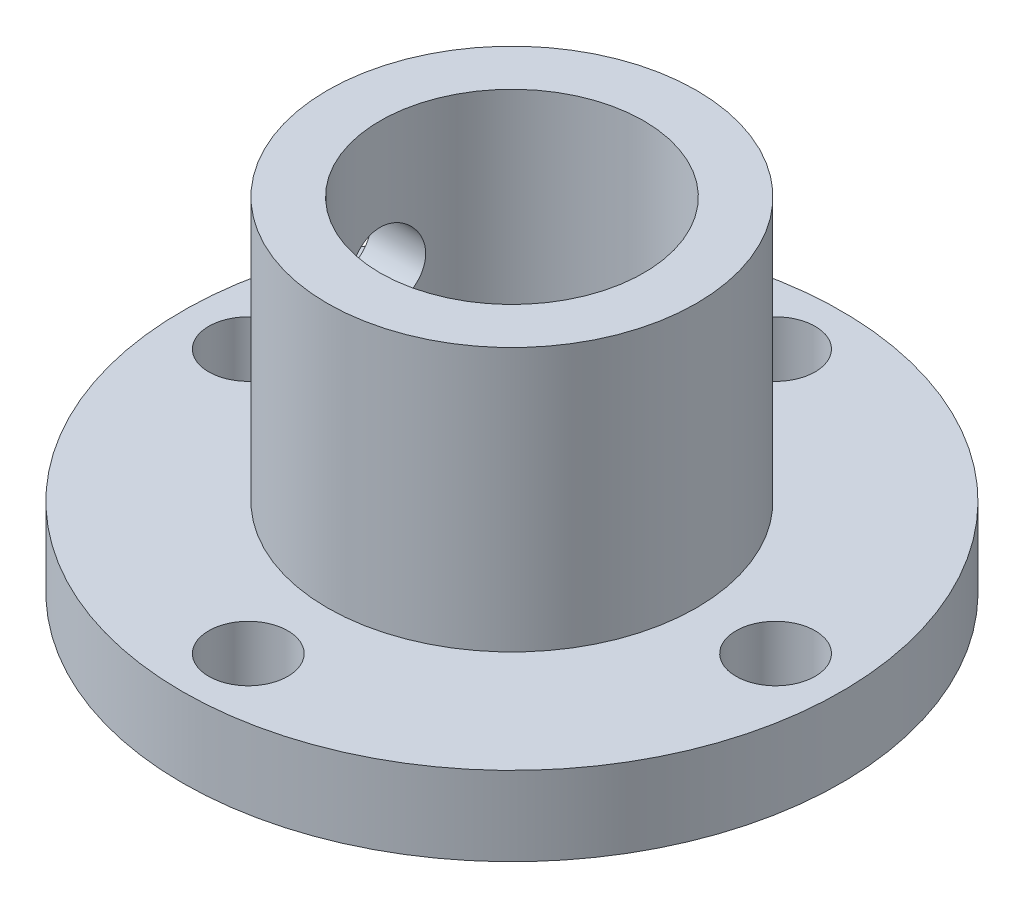
ISO-10303-21;
HEADER;
FILE_DESCRIPTION(('STEP AP214'),'2;1');
FILE_NAME('part.step','',(''),(''),'','','');
FILE_SCHEMA(('AUTOMOTIVE_DESIGN { 1 0 10303 214 1 1 1 1 }'));
ENDSEC;
DATA;
#1=APPLICATION_CONTEXT('core data for automotive mechanical design processes');
#2=APPLICATION_PROTOCOL_DEFINITION('international standard','automotive_design',2000,#1);
#3=PRODUCT_CONTEXT('',#1,'mechanical');
#4=PRODUCT('Part','Part','',(#3));
#5=PRODUCT_RELATED_PRODUCT_CATEGORY('part','',(#4));
#6=PRODUCT_DEFINITION_FORMATION('','',#4);
#7=PRODUCT_DEFINITION_CONTEXT('part definition',#1,'design');
#8=PRODUCT_DEFINITION('design','',#6,#7);
#9=PRODUCT_DEFINITION_SHAPE('','',#8);
#10=(LENGTH_UNIT() NAMED_UNIT(*) SI_UNIT(.MILLI.,.METRE.));
#11=(NAMED_UNIT(*) PLANE_ANGLE_UNIT() SI_UNIT($,.RADIAN.));
#12=(NAMED_UNIT(*) SI_UNIT($,.STERADIAN.) SOLID_ANGLE_UNIT());
#13=UNCERTAINTY_MEASURE_WITH_UNIT(LENGTH_MEASURE(1.E-05),#10,'distance_accuracy_value','');
#14=(GEOMETRIC_REPRESENTATION_CONTEXT(3) GLOBAL_UNCERTAINTY_ASSIGNED_CONTEXT((#13)) GLOBAL_UNIT_ASSIGNED_CONTEXT((#10,
#11,#12)) REPRESENTATION_CONTEXT('',''));
#15=CARTESIAN_POINT('',(0.,0.,0.));
#16=DIRECTION('',(0.,0.,1.));
#17=DIRECTION('',(1.,0.,0.));
#18=AXIS2_PLACEMENT_3D('',#15,#16,#17);
#19=CARTESIAN_POINT('',(0.,3.,0.));
#20=DIRECTION('',(0.,1.,0.));
#21=DIRECTION('',(0.,0.,1.));
#22=AXIS2_PLACEMENT_3D('',#19,#20,#21);
#23=PLANE('',#22);
#24=CARTESIAN_POINT('',(0.,3.,0.));
#25=DIRECTION('',(0.,1.,0.));
#26=DIRECTION('',(1.,0.,0.));
#27=AXIS2_PLACEMENT_3D('',#24,#25,#26);
#28=CIRCLE('',#27,7.);
#29=CARTESIAN_POINT('',(7.,3.,0.));
#30=VERTEX_POINT('',#29);
#31=EDGE_CURVE('E87',#30,#30,#28,.T.);
#32=ORIENTED_EDGE('',*,*,#31,.F.);
#33=EDGE_LOOP('',(#32));
#34=FACE_BOUND('',#33,.T.);
#35=CARTESIAN_POINT('',(-10.,3.,0.));
#36=DIRECTION('',(0.,1.,0.));
#37=DIRECTION('',(0.,0.,1.));
#38=AXIS2_PLACEMENT_3D('',#35,#36,#37);
#39=CIRCLE('',#38,1.5);
#40=CARTESIAN_POINT('',(-10.,3.,1.5));
#41=VERTEX_POINT('',#40);
#42=EDGE_CURVE('E72',#41,#41,#39,.T.);
#43=ORIENTED_EDGE('',*,*,#42,.F.);
#44=EDGE_LOOP('',(#43));
#45=FACE_BOUND('',#44,.T.);
#46=CARTESIAN_POINT('',(10.,3.,0.));
#47=DIRECTION('',(0.,1.,0.));
#48=DIRECTION('',(0.,0.,1.));
#49=AXIS2_PLACEMENT_3D('',#46,#47,#48);
#50=CIRCLE('',#49,1.5);
#51=CARTESIAN_POINT('',(10.,3.,1.5));
#52=VERTEX_POINT('',#51);
#53=EDGE_CURVE('E61',#52,#52,#50,.T.);
#54=ORIENTED_EDGE('',*,*,#53,.F.);
#55=EDGE_LOOP('',(#54));
#56=FACE_BOUND('',#55,.T.);
#57=CARTESIAN_POINT('',(0.,3.,0.));
#58=DIRECTION('',(0.,1.,0.));
#59=DIRECTION('',(0.,0.,1.));
#60=AXIS2_PLACEMENT_3D('',#57,#58,#59);
#61=CIRCLE('',#60,12.5);
#62=CARTESIAN_POINT('',(0.,3.,12.5));
#63=VERTEX_POINT('',#62);
#64=EDGE_CURVE('E11',#63,#63,#61,.T.);
#65=ORIENTED_EDGE('',*,*,#64,.T.);
#66=EDGE_LOOP('',(#65));
#67=FACE_BOUND('',#66,.T.);
#68=CARTESIAN_POINT('',(0.,3.,10.));
#69=DIRECTION('',(0.,1.,0.));
#70=DIRECTION('',(0.,0.,1.));
#71=AXIS2_PLACEMENT_3D('',#68,#69,#70);
#72=CIRCLE('',#71,1.5);
#73=CARTESIAN_POINT('',(0.,3.,11.5));
#74=VERTEX_POINT('',#73);
#75=EDGE_CURVE('E66',#74,#74,#72,.T.);
#76=ORIENTED_EDGE('',*,*,#75,.F.);
#77=EDGE_LOOP('',(#76));
#78=FACE_BOUND('',#77,.T.);
#79=CARTESIAN_POINT('',(0.,3.,-10.));
#80=DIRECTION('',(0.,1.,0.));
#81=DIRECTION('',(0.,0.,1.));
#82=AXIS2_PLACEMENT_3D('',#79,#80,#81);
#83=CIRCLE('',#82,1.5);
#84=CARTESIAN_POINT('',(0.,3.,-8.5));
#85=VERTEX_POINT('',#84);
#86=EDGE_CURVE('E78',#85,#85,#83,.T.);
#87=ORIENTED_EDGE('',*,*,#86,.F.);
#88=EDGE_LOOP('',(#87));
#89=FACE_BOUND('',#88,.T.);
#90=ADVANCED_FACE('F43',(#34,#45,#56,#67,#78,#89),#23,.T.);
#91=CARTESIAN_POINT('',(0.,0.,0.));
#92=DIRECTION('',(0.,1.,0.));
#93=DIRECTION('',(0.,0.,1.));
#94=AXIS2_PLACEMENT_3D('',#91,#92,#93);
#95=PLANE('',#94);
#96=CARTESIAN_POINT('',(0.,0.,0.));
#97=DIRECTION('',(0.,1.,0.));
#98=DIRECTION('',(0.,0.,1.));
#99=AXIS2_PLACEMENT_3D('',#96,#97,#98);
#100=CIRCLE('',#99,5.);
#101=CARTESIAN_POINT('',(0.,0.,5.));
#102=VERTEX_POINT('',#101);
#103=EDGE_CURVE('E102',#102,#102,#100,.T.);
#104=ORIENTED_EDGE('',*,*,#103,.T.);
#105=EDGE_LOOP('',(#104));
#106=FACE_BOUND('',#105,.T.);
#107=CARTESIAN_POINT('',(0.,0.,0.));
#108=DIRECTION('',(0.,1.,0.));
#109=DIRECTION('',(0.,0.,1.));
#110=AXIS2_PLACEMENT_3D('',#107,#108,#109);
#111=CIRCLE('',#110,12.5);
#112=CARTESIAN_POINT('',(0.,0.,12.5));
#113=VERTEX_POINT('',#112);
#114=EDGE_CURVE('E56',#113,#113,#111,.T.);
#115=ORIENTED_EDGE('',*,*,#114,.F.);
#116=EDGE_LOOP('',(#115));
#117=FACE_BOUND('',#116,.T.);
#118=CARTESIAN_POINT('',(10.,0.,0.));
#119=DIRECTION('',(0.,1.,0.));
#120=DIRECTION('',(0.,0.,1.));
#121=AXIS2_PLACEMENT_3D('',#118,#119,#120);
#122=CIRCLE('',#121,1.5);
#123=CARTESIAN_POINT('',(10.,0.,1.5));
#124=VERTEX_POINT('',#123);
#125=EDGE_CURVE('E63',#124,#124,#122,.T.);
#126=ORIENTED_EDGE('',*,*,#125,.T.);
#127=EDGE_LOOP('',(#126));
#128=FACE_BOUND('',#127,.T.);
#129=CARTESIAN_POINT('',(0.,0.,10.));
#130=DIRECTION('',(0.,1.,0.));
#131=DIRECTION('',(0.,0.,1.));
#132=AXIS2_PLACEMENT_3D('',#129,#130,#131);
#133=CIRCLE('',#132,1.5);
#134=CARTESIAN_POINT('',(0.,0.,11.5));
#135=VERTEX_POINT('',#134);
#136=EDGE_CURVE('E69',#135,#135,#133,.T.);
#137=ORIENTED_EDGE('',*,*,#136,.T.);
#138=EDGE_LOOP('',(#137));
#139=FACE_BOUND('',#138,.T.);
#140=CARTESIAN_POINT('',(-10.,0.,0.));
#141=DIRECTION('',(0.,1.,0.));
#142=DIRECTION('',(0.,0.,1.));
#143=AXIS2_PLACEMENT_3D('',#140,#141,#142);
#144=CIRCLE('',#143,1.5);
#145=CARTESIAN_POINT('',(-10.,0.,1.5));
#146=VERTEX_POINT('',#145);
#147=EDGE_CURVE('E75',#146,#146,#144,.T.);
#148=ORIENTED_EDGE('',*,*,#147,.T.);
#149=EDGE_LOOP('',(#148));
#150=FACE_BOUND('',#149,.T.);
#151=CARTESIAN_POINT('',(0.,0.,-10.));
#152=DIRECTION('',(0.,1.,0.));
#153=DIRECTION('',(0.,0.,1.));
#154=AXIS2_PLACEMENT_3D('',#151,#152,#153);
#155=CIRCLE('',#154,1.5);
#156=CARTESIAN_POINT('',(0.,0.,-8.5));
#157=VERTEX_POINT('',#156);
#158=EDGE_CURVE('E81',#157,#157,#155,.T.);
#159=ORIENTED_EDGE('',*,*,#158,.T.);
#160=EDGE_LOOP('',(#159));
#161=FACE_BOUND('',#160,.T.);
#162=ADVANCED_FACE('F129',(#106,#117,#128,#139,#150,#161),#95,.F.);
#163=CARTESIAN_POINT('',(0.,3.,0.));
#164=DIRECTION('',(0.,-1.,0.));
#165=DIRECTION('',(0.,0.,-1.));
#166=AXIS2_PLACEMENT_3D('',#163,#164,#165);
#167=CYLINDRICAL_SURFACE('',#166,12.5);
#168=ORIENTED_EDGE('',*,*,#64,.F.);
#169=EDGE_LOOP('',(#168));
#170=FACE_BOUND('',#169,.T.);
#171=ORIENTED_EDGE('',*,*,#114,.T.);
#172=EDGE_LOOP('',(#171));
#173=FACE_BOUND('',#172,.T.);
#174=ADVANCED_FACE('F45',(#170,#173),#167,.T.);
#175=CARTESIAN_POINT('',(10.,3.,0.));
#176=DIRECTION('',(0.,-1.,0.));
#177=DIRECTION('',(0.,0.,-1.));
#178=AXIS2_PLACEMENT_3D('',#175,#176,#177);
#179=CYLINDRICAL_SURFACE('',#178,1.5);
#180=ORIENTED_EDGE('',*,*,#53,.T.);
#181=EDGE_LOOP('',(#180));
#182=FACE_BOUND('',#181,.T.);
#183=ORIENTED_EDGE('',*,*,#125,.F.);
#184=EDGE_LOOP('',(#183));
#185=FACE_BOUND('',#184,.T.);
#186=ADVANCED_FACE('F140',(#182,#185),#179,.F.);
#187=CARTESIAN_POINT('',(0.,3.,10.));
#188=DIRECTION('',(0.,-1.,0.));
#189=DIRECTION('',(0.,0.,-1.));
#190=AXIS2_PLACEMENT_3D('',#187,#188,#189);
#191=CYLINDRICAL_SURFACE('',#190,1.5);
#192=ORIENTED_EDGE('',*,*,#75,.T.);
#193=EDGE_LOOP('',(#192));
#194=FACE_BOUND('',#193,.T.);
#195=ORIENTED_EDGE('',*,*,#136,.F.);
#196=EDGE_LOOP('',(#195));
#197=FACE_BOUND('',#196,.T.);
#198=ADVANCED_FACE('F143',(#194,#197),#191,.F.);
#199=CARTESIAN_POINT('',(-10.,3.,0.));
#200=DIRECTION('',(0.,-1.,0.));
#201=DIRECTION('',(0.,0.,-1.));
#202=AXIS2_PLACEMENT_3D('',#199,#200,#201);
#203=CYLINDRICAL_SURFACE('',#202,1.5);
#204=ORIENTED_EDGE('',*,*,#42,.T.);
#205=EDGE_LOOP('',(#204));
#206=FACE_BOUND('',#205,.T.);
#207=ORIENTED_EDGE('',*,*,#147,.F.);
#208=EDGE_LOOP('',(#207));
#209=FACE_BOUND('',#208,.T.);
#210=ADVANCED_FACE('F125',(#206,#209),#203,.F.);
#211=CARTESIAN_POINT('',(0.,3.,-10.));
#212=DIRECTION('',(0.,-1.,0.));
#213=DIRECTION('',(0.,0.,-1.));
#214=AXIS2_PLACEMENT_3D('',#211,#212,#213);
#215=CYLINDRICAL_SURFACE('',#214,1.5);
#216=ORIENTED_EDGE('',*,*,#86,.T.);
#217=EDGE_LOOP('',(#216));
#218=FACE_BOUND('',#217,.T.);
#219=ORIENTED_EDGE('',*,*,#158,.F.);
#220=EDGE_LOOP('',(#219));
#221=FACE_BOUND('',#220,.T.);
#222=ADVANCED_FACE('F118',(#218,#221),#215,.F.);
#223=CARTESIAN_POINT('',(0.,13.,0.));
#224=DIRECTION('',(0.,1.,0.));
#225=DIRECTION('',(0.,0.,1.));
#226=AXIS2_PLACEMENT_3D('',#223,#224,#225);
#227=PLANE('',#226);
#228=CARTESIAN_POINT('',(0.,13.,0.));
#229=DIRECTION('',(0.,1.,0.));
#230=DIRECTION('',(1.,0.,0.));
#231=AXIS2_PLACEMENT_3D('',#228,#229,#230);
#232=CIRCLE('',#231,7.);
#233=CARTESIAN_POINT('',(7.,13.,0.));
#234=VERTEX_POINT('',#233);
#235=EDGE_CURVE('E84',#234,#234,#232,.T.);
#236=ORIENTED_EDGE('',*,*,#235,.T.);
#237=EDGE_LOOP('',(#236));
#238=FACE_BOUND('',#237,.T.);
#239=CARTESIAN_POINT('',(0.,13.,0.));
#240=DIRECTION('',(0.,1.,0.));
#241=DIRECTION('',(0.,0.,1.));
#242=AXIS2_PLACEMENT_3D('',#239,#240,#241);
#243=CIRCLE('',#242,5.);
#244=CARTESIAN_POINT('',(0.,13.,5.));
#245=VERTEX_POINT('',#244);
#246=EDGE_CURVE('E90',#245,#245,#243,.T.);
#247=ORIENTED_EDGE('',*,*,#246,.F.);
#248=EDGE_LOOP('',(#247));
#249=FACE_BOUND('',#248,.T.);
#250=ADVANCED_FACE('F116',(#238,#249),#227,.T.);
#251=CARTESIAN_POINT('',(0.,13.,0.));
#252=DIRECTION('',(0.,-1.,0.));
#253=DIRECTION('',(0.,0.,-1.));
#254=AXIS2_PLACEMENT_3D('',#251,#252,#253);
#255=CYLINDRICAL_SURFACE('',#254,7.);
#256=CARTESIAN_POINT('',(-6.83739716558867,8.,-1.5));
#257=CARTESIAN_POINT('',(-6.83739884558951,8.08321115248195,-1.49999708238613));
#258=CARTESIAN_POINT('',(-6.83893272341929,8.16645777394212,-1.49305236244768));
#259=CARTESIAN_POINT('',(-6.84489178429867,8.33058667224201,-1.46548559252999));
#260=CARTESIAN_POINT('',(-6.84931911211841,8.41146714867621,-1.44485339653622));
#261=CARTESIAN_POINT('',(-6.86054115293409,8.5684657495742,-1.39058863684599));
#262=CARTESIAN_POINT('',(-6.86733332725825,8.64458887812147,-1.35697000991314));
#263=CARTESIAN_POINT('',(-6.88251670848644,8.79011527394461,-1.27772617673341));
#264=CARTESIAN_POINT('',(-6.89090786877545,8.85951873702908,-1.23210132048776));
#265=CARTESIAN_POINT('',(-6.90849578796654,8.99076296148212,-1.12935142570221));
#266=CARTESIAN_POINT('',(-6.91770249871754,9.05247887623996,-1.07206859483983));
#267=CARTESIAN_POINT('',(-6.93579691710397,9.16550355440578,-0.947969508129577));
#268=CARTESIAN_POINT('',(-6.94468460051417,9.21681152886007,-0.881152530217676));
#269=CARTESIAN_POINT('',(-6.96124769109432,9.30805544449143,-0.739047288464582));
#270=CARTESIAN_POINT('',(-6.96890998819429,9.34787165577062,-0.663680488229954));
#271=CARTESIAN_POINT('',(-6.98204671042934,9.41422769144629,-0.507134269342596));
#272=CARTESIAN_POINT('',(-6.98752137103329,9.44076894478628,-0.425955477380312));
#273=CARTESIAN_POINT('',(-6.9955956528118,9.47942997093134,-0.261387187671512));
#274=CARTESIAN_POINT('',(-6.99823733378385,9.49176092855243,-0.178049400596923));
#275=CARTESIAN_POINT('',(-7.00049362207002,9.50231127731326,-0.0104489453066449));
#276=CARTESIAN_POINT('',(-7.00010856232698,9.50053222056076,0.0738136201647589));
#277=CARTESIAN_POINT('',(-6.99638700862558,9.48307103533642,0.239417029250511));
#278=CARTESIAN_POINT('',(-6.99309883152432,9.46761649971008,0.320783115362112));
#279=CARTESIAN_POINT('',(-6.98399541589104,9.42360531814814,0.479739463978388));
#280=CARTESIAN_POINT('',(-6.97818006616518,9.39504809570026,0.557329560175054));
#281=CARTESIAN_POINT('',(-6.96459754646858,9.32543854111148,0.707167497556552));
#282=CARTESIAN_POINT('',(-6.95681685803946,9.28429923279565,0.779373657015788));
#283=CARTESIAN_POINT('',(-6.94015793743865,9.1907580318364,0.915940926562845));
#284=CARTESIAN_POINT('',(-6.93127956144693,9.1383546626997,0.980301006451528));
#285=CARTESIAN_POINT('',(-6.91319326460925,9.02253145547214,1.10070208800198));
#286=CARTESIAN_POINT('',(-6.90398230372853,8.95891242064296,1.1565511732025));
#287=CARTESIAN_POINT('',(-6.88643566831974,8.82311671493149,1.25682243234728));
#288=CARTESIAN_POINT('',(-6.87810001563386,8.75093983059475,1.30124432118068));
#289=CARTESIAN_POINT('',(-6.86324023586723,8.59977549893624,1.37748077573296));
#290=CARTESIAN_POINT('',(-6.85672115127775,8.52076987614756,1.40926035088923));
#291=CARTESIAN_POINT('',(-6.84630340806617,8.35836723405356,1.45903495159115));
#292=CARTESIAN_POINT('',(-6.84240435218483,8.27497088255681,1.47703206694628));
#293=CARTESIAN_POINT('',(-6.83774881255446,8.10790424735029,1.49843586024652));
#294=CARTESIAN_POINT('',(-6.83693227051701,8.0242713249227,1.5021214192864));
#295=CARTESIAN_POINT('',(-6.83837239573993,7.85758600681831,1.49555139642373));
#296=CARTESIAN_POINT('',(-6.84062886101063,7.77453357334645,1.48529673081635));
#297=CARTESIAN_POINT('',(-6.84790415484206,7.61232956501924,1.45137894635584));
#298=CARTESIAN_POINT('',(-6.85289155274364,7.53314456740304,1.42786830251553));
#299=CARTESIAN_POINT('',(-6.86503859869777,7.37983766246708,1.36827052946749));
#300=CARTESIAN_POINT('',(-6.87219844772849,7.30571622436581,1.33218223662818));
#301=CARTESIAN_POINT('',(-6.88801634080345,7.16343031524108,1.24783504416705));
#302=CARTESIAN_POINT('',(-6.89669501746317,7.09537041798782,1.19940368590792));
#303=CARTESIAN_POINT('',(-6.91451775360139,6.96824165412621,1.09197183833601));
#304=CARTESIAN_POINT('',(-6.92366186834461,6.90917385855153,1.03297009182161));
#305=CARTESIAN_POINT('',(-6.94158239990173,6.80062969705524,0.904812764420814));
#306=CARTESIAN_POINT('',(-6.95034935607746,6.75134308384299,0.835494925828771));
#307=CARTESIAN_POINT('',(-6.96635610714901,6.66511459064895,0.689401481282277));
#308=CARTESIAN_POINT('',(-6.97359597176692,6.62817214702717,0.61262621604374));
#309=CARTESIAN_POINT('',(-6.98569278381574,6.56794794536152,0.454265418982041));
#310=CARTESIAN_POINT('',(-6.99056443803698,6.54458169625372,0.372713193075173));
#311=CARTESIAN_POINT('',(-6.9974393930198,6.51190829426768,0.20672517700329));
#312=CARTESIAN_POINT('',(-6.99944309312296,6.50259918402609,0.122289789973994));
#313=CARTESIAN_POINT('',(-7.00034511009057,6.49838934758814,-0.0452637170528279));
#314=CARTESIAN_POINT('',(-6.99930459001667,6.50320484139538,-0.128374505509228));
#315=CARTESIAN_POINT('',(-6.99436552363383,6.52647476351903,-0.292572938415959));
#316=CARTESIAN_POINT('',(-6.99046702473686,6.54492896557832,-0.373660616405284));
#317=CARTESIAN_POINT('',(-6.98025388638537,6.59481880624949,-0.531301948487269));
#318=CARTESIAN_POINT('',(-6.97394646430492,6.62621568938556,-0.607868365073176));
#319=CARTESIAN_POINT('',(-6.95959036050661,6.70106127116912,-0.754684956723219));
#320=CARTESIAN_POINT('',(-6.9515415172034,6.74451108830603,-0.82493454479614));
#321=CARTESIAN_POINT('',(-6.93439809934494,6.84316231874267,-0.958512306895243));
#322=CARTESIAN_POINT('',(-6.92528708907874,6.89856415832131,-1.02169036510577));
#323=CARTESIAN_POINT('',(-6.90713690075836,7.01914061025035,-1.13795001457643));
#324=CARTESIAN_POINT('',(-6.89809774045682,7.08431756335561,-1.19102918062422));
#325=CARTESIAN_POINT('',(-6.88098693651916,7.22359049318568,-1.28623261596675));
#326=CARTESIAN_POINT('',(-6.87292905956533,7.29778935828702,-1.32820897809616));
#327=CARTESIAN_POINT('',(-6.85886497228049,7.45234372092325,-1.39903004659825));
#328=CARTESIAN_POINT('',(-6.85285699581573,7.53269384525307,-1.42788606423931));
#329=CARTESIAN_POINT('',(-6.84470560641996,7.67762613118586,-1.46638607121557));
#330=CARTESIAN_POINT('',(-6.84198283087953,7.74141167570783,-1.47896752507743));
#331=CARTESIAN_POINT('',(-6.83832799504406,7.87012431157732,-1.49577544043437));
#332=CARTESIAN_POINT('',(-6.83739585430069,7.93505135150832,-1.50000227727981));
#333=CARTESIAN_POINT('',(-6.83739716558867,8.,-1.5));
#334=B_SPLINE_CURVE_WITH_KNOTS('',3,(#256,#257,#258,#259,#260,#261,#262,#263,#264,#265,#266,
#267,#268,#269,#270,#271,#272,#273,#274,#275,#276,#277,#278,#279,#280,#281,#282,#283,#284,#285,
#286,#287,#288,#289,#290,#291,#292,#293,#294,#295,#296,#297,#298,#299,#300,#301,#302,#303,#304,
#305,#306,#307,#308,#309,#310,#311,#312,#313,#314,#315,#316,#317,#318,#319,#320,#321,#322,#323,
#324,#325,#326,#327,#328,#329,#330,#331,#332,#333),.UNSPECIFIED.,.T.,.F.,(4,2,2,2,2,2,2,2,2,2,2,
2,2,2,2,2,2,2,2,2,2,2,2,2,2,2,2,2,2,2,2,2,2,2,2,2,2,2,4),(0.,0.249395482027529,
0.498976038479964,0.748289491152758,0.997595676735284,1.25053229582692,1.50348808112879,
1.75899134820278,2.01446710646268,2.26609508151929,2.51769537777241,2.76518557667371,
3.01268666607584,3.26193888143437,3.51122378872315,3.76548960779295,4.01976177023092,
4.27473287411781,4.52966530953839,4.77960433192523,5.02952692653916,5.27663180749375,
5.5237595556315,5.77455010216318,6.02537049659078,6.2806621468321,6.53594213875541,
6.78961589824375,7.04325433208539,7.29183199644126,7.54040553715099,7.78824009619483,
8.03609766151365,8.28848914160965,8.54094115631232,8.79660380167248,9.05204561611687,
9.24671456122271,9.44137476018022),.UNSPECIFIED.);
#335=CARTESIAN_POINT('',(-6.83739716558867,8.,-1.5));
#336=VERTEX_POINT('',#335);
#337=EDGE_CURVE('E95',#336,#336,#334,.T.);
#338=ORIENTED_EDGE('',*,*,#337,.T.);
#339=EDGE_LOOP('',(#338));
#340=FACE_BOUND('',#339,.T.);
#341=ORIENTED_EDGE('',*,*,#235,.F.);
#342=EDGE_LOOP('',(#341));
#343=FACE_BOUND('',#342,.T.);
#344=ORIENTED_EDGE('',*,*,#31,.T.);
#345=EDGE_LOOP('',(#344));
#346=FACE_BOUND('',#345,.T.);
#347=ADVANCED_FACE('F103',(#340,#343,#346),#255,.T.);
#348=CARTESIAN_POINT('',(0.,13.,0.));
#349=DIRECTION('',(0.,-1.,0.));
#350=DIRECTION('',(0.,0.,-1.));
#351=AXIS2_PLACEMENT_3D('',#348,#349,#350);
#352=CYLINDRICAL_SURFACE('',#351,5.);
#353=CARTESIAN_POINT('',(-4.76969600708473,8.,-1.5));
#354=CARTESIAN_POINT('',(-4.7696968572698,8.0821945479424,-1.49999897633764));
#355=CARTESIAN_POINT('',(-4.77184390209069,8.16439922414402,-1.49322108167142));
#356=CARTESIAN_POINT('',(-4.780165783029,8.32640524959194,-1.46635844446749));
#357=CARTESIAN_POINT('',(-4.78634196493468,8.40620578650146,-1.44626925573578));
#358=CARTESIAN_POINT('',(-4.80196102485632,8.56103472827173,-1.39352753269955));
#359=CARTESIAN_POINT('',(-4.81139846703232,8.63607082963309,-1.36089589394243));
#360=CARTESIAN_POINT('',(-4.83246932547567,8.7796219339953,-1.28406421917929));
#361=CARTESIAN_POINT('',(-4.84410307041019,8.84813595868444,-1.23986245137053));
#362=CARTESIAN_POINT('',(-4.86866862185765,8.97886639057737,-1.13964754141627));
#363=CARTESIAN_POINT('',(-4.88162808311636,9.04084589794629,-1.08333207175807));
#364=CARTESIAN_POINT('',(-4.90714861936757,9.15463795132251,-0.9611362375796));
#365=CARTESIAN_POINT('',(-4.91970964297705,9.20644919044988,-0.895254645461112));
#366=CARTESIAN_POINT('',(-4.94333214579389,9.29946269983331,-0.754111437793691));
#367=CARTESIAN_POINT('',(-4.95435724342404,9.34042342444281,-0.678684021335816));
#368=CARTESIAN_POINT('',(-4.97334435920684,9.40898725904276,-0.521624645369355));
#369=CARTESIAN_POINT('',(-4.98130703789495,9.43659324985745,-0.439994028387913));
#370=CARTESIAN_POINT('',(-4.99307646003589,9.47688000109051,-0.27532385263083));
#371=CARTESIAN_POINT('',(-4.99699557369338,9.4899651276527,-0.192391398953802));
#372=CARTESIAN_POINT('',(-5.00063201501348,9.50211732464644,-0.0254218237493157));
#373=CARTESIAN_POINT('',(-5.00035022521079,9.50118733940196,0.0586150620503675));
#374=CARTESIAN_POINT('',(-4.99569603817659,9.48560713145698,0.222571156600159));
#375=CARTESIAN_POINT('',(-4.9914542020526,9.47139480619013,0.30253626764134));
#376=CARTESIAN_POINT('',(-4.97951522112593,9.43036866400571,0.458889213442526));
#377=CARTESIAN_POINT('',(-4.97181785750586,9.40355404905733,0.535276821322845));
#378=CARTESIAN_POINT('',(-4.95365220986963,9.33778797658144,0.68334732635128));
#379=CARTESIAN_POINT('',(-4.94315269676706,9.29869879719273,0.754965064694477));
#380=CARTESIAN_POINT('',(-4.92049640648069,9.20960214757177,0.890764673783155));
#381=CARTESIAN_POINT('',(-4.90833923637778,9.15959208703652,0.95494477487213));
#382=CARTESIAN_POINT('',(-4.88311550488166,9.0478022492484,1.0766604815298));
#383=CARTESIAN_POINT('',(-4.87003195321461,8.98564308097026,1.13384458040111));
#384=CARTESIAN_POINT('',(-4.84483979887497,8.85248998210995,1.23707651539823));
#385=CARTESIAN_POINT('',(-4.8327312931702,8.78149517461077,1.28312324482852));
#386=CARTESIAN_POINT('',(-4.81077903197678,8.63176053075101,1.3631399533545));
#387=CARTESIAN_POINT('',(-4.80095810695957,8.55295295413708,1.39698989237679));
#388=CARTESIAN_POINT('',(-4.78496392548436,8.39039279155446,1.45083362878413));
#389=CARTESIAN_POINT('',(-4.7787894791583,8.30664182846544,1.4708319464056));
#390=CARTESIAN_POINT('',(-4.77104849541241,8.13991763926072,1.49574770282165));
#391=CARTESIAN_POINT('',(-4.76931878670441,8.05703177610602,1.50119946380212));
#392=CARTESIAN_POINT('',(-4.77021192441924,7.89152709999014,1.49835947233062));
#393=CARTESIAN_POINT('',(-4.77283416156589,7.80890825126915,1.4900696437133));
#394=CARTESIAN_POINT('',(-4.78197558554912,7.64851162202913,1.4604576357419));
#395=CARTESIAN_POINT('',(-4.78839176507489,7.57066383573648,1.4394796143128));
#396=CARTESIAN_POINT('',(-4.80429141231227,7.41959830918509,1.3854857774794));
#397=CARTESIAN_POINT('',(-4.81377535359073,7.34638128585943,1.3524681034276));
#398=CARTESIAN_POINT('',(-4.83505835023047,7.20448253592787,1.274318711965));
#399=CARTESIAN_POINT('',(-4.84691271069799,7.13597527901421,1.22888564172729));
#400=CARTESIAN_POINT('',(-4.87148205646987,7.0073618938192,1.12755301600385));
#401=CARTESIAN_POINT('',(-4.88419724730003,6.94725778238721,1.07165095534897));
#402=CARTESIAN_POINT('',(-4.90963633548158,6.83481959418526,0.9484551324936));
#403=CARTESIAN_POINT('',(-4.92234245063004,6.78286437101302,0.880811065857435));
#404=CARTESIAN_POINT('',(-4.94584851748651,6.69103329897225,0.73746178459025));
#405=CARTESIAN_POINT('',(-4.95664856384717,6.65115685021854,0.661756970543945));
#406=CARTESIAN_POINT('',(-4.97505970474957,6.58499996943171,0.504935504705222));
#407=CARTESIAN_POINT('',(-4.98269453424966,6.55861798384103,0.42386462203784));
#408=CARTESIAN_POINT('',(-4.99401979596827,6.51993908110958,0.258169966504589));
#409=CARTESIAN_POINT('',(-4.9977113567088,6.50763813405158,0.173547217354764));
#410=CARTESIAN_POINT('',(-5.00066544081399,6.4977769559455,0.00665215388274413));
#411=CARTESIAN_POINT('',(-5.00009305111322,6.49966730459217,-0.0755851790862051));
#412=CARTESIAN_POINT('',(-4.99497264465037,6.51682163249912,-0.238519481164402));
#413=CARTESIAN_POINT('',(-4.99042485330462,6.53208485348044,-0.319216537346527));
#414=CARTESIAN_POINT('',(-4.97791168358327,6.57521166139962,-0.475935813041357));
#415=CARTESIAN_POINT('',(-4.96998352900866,6.60293818064901,-0.55199892735139));
#416=CARTESIAN_POINT('',(-4.9515294303945,6.67008191450719,-0.698433237752051));
#417=CARTESIAN_POINT('',(-4.94100305949946,6.70950105028619,-0.768803496050578));
#418=CARTESIAN_POINT('',(-4.91803965828228,6.80037345743004,-0.904301892420563));
#419=CARTESIAN_POINT('',(-4.90555226923559,6.85217143000077,-0.969190250076767));
#420=CARTESIAN_POINT('',(-4.88023537212334,6.9657103883328,-1.08953757134594));
#421=CARTESIAN_POINT('',(-4.86740576641079,7.02745423789815,-1.14499380960193));
#422=CARTESIAN_POINT('',(-4.84240680631319,7.16134077831051,-1.24656269394549));
#423=CARTESIAN_POINT('',(-4.83026852693485,7.23373855339044,-1.29234759757956));
#424=CARTESIAN_POINT('',(-4.80852547508793,7.38555517416102,-1.37104313528776));
#425=CARTESIAN_POINT('',(-4.79891948596955,7.46497062360119,-1.40395995557288));
#426=CARTESIAN_POINT('',(-4.78427816717595,7.61974043160627,-1.45301942532949));
#427=CARTESIAN_POINT('',(-4.7788615484052,7.69460864693099,-1.47058859011232));
#428=CARTESIAN_POINT('',(-4.77157042597167,7.84631522249577,-1.49407818835144));
#429=CARTESIAN_POINT('',(-4.7696952122143,7.92315318464525,-1.50000095706095));
#430=CARTESIAN_POINT('',(-4.76969600708473,8.,-1.5));
#431=B_SPLINE_CURVE_WITH_KNOTS('',3,(#353,#354,#355,#356,#357,#358,#359,#360,#361,#362,#363,
#364,#365,#366,#367,#368,#369,#370,#371,#372,#373,#374,#375,#376,#377,#378,#379,#380,#381,#382,
#383,#384,#385,#386,#387,#388,#389,#390,#391,#392,#393,#394,#395,#396,#397,#398,#399,#400,#401,
#402,#403,#404,#405,#406,#407,#408,#409,#410,#411,#412,#413,#414,#415,#416,#417,#418,#419,#420,
#421,#422,#423,#424,#425,#426,#427,#428,#429,#430),.UNSPECIFIED.,.T.,.F.,(4,2,2,2,2,2,2,2,2,2,2,
2,2,2,2,2,2,2,2,2,2,2,2,2,2,2,2,2,2,2,2,2,2,2,2,2,2,2,4),(0.,0.246300165915542,
0.492682641688999,0.738656414466193,0.9846670253701,1.23773150007984,1.49082847871273,
1.74915939273644,2.00743455587877,2.25832140149558,2.5091555410144,2.7520012599088,
2.99486235890376,3.24055209335676,3.4863001659083,3.74152147023278,3.99676812491863,
4.25446238246266,4.51207250628411,4.76008080790309,5.00805439107387,5.24958594938817,
5.49115481045787,5.73920731809388,5.98731925928923,6.24479506100602,6.50225807324202,
6.75775391814325,7.01317662321682,7.2587630391122,7.50433553047754,7.74727096872219,
7.99024634491378,8.24099627054488,8.4918185262989,8.75011639669147,9.00828993963944,
9.23861153857447,9.4688869503356),.UNSPECIFIED.);
#432=CARTESIAN_POINT('',(-4.76969600708473,8.,-1.5));
#433=VERTEX_POINT('',#432);
#434=EDGE_CURVE('E47',#433,#433,#431,.T.);
#435=ORIENTED_EDGE('',*,*,#434,.F.);
#436=EDGE_LOOP('',(#435));
#437=FACE_BOUND('',#436,.T.);
#438=ORIENTED_EDGE('',*,*,#246,.T.);
#439=EDGE_LOOP('',(#438));
#440=FACE_BOUND('',#439,.T.);
#441=ORIENTED_EDGE('',*,*,#103,.F.);
#442=EDGE_LOOP('',(#441));
#443=FACE_BOUND('',#442,.T.);
#444=ADVANCED_FACE('F110',(#437,#440,#443),#352,.F.);
#445=CARTESIAN_POINT('',(-12.5,8.,0.));
#446=DIRECTION('',(1.,0.,0.));
#447=DIRECTION('',(0.,0.,-1.));
#448=AXIS2_PLACEMENT_3D('',#445,#446,#447);
#449=CYLINDRICAL_SURFACE('',#448,1.5);
#450=ORIENTED_EDGE('',*,*,#434,.T.);
#451=EDGE_LOOP('',(#450));
#452=FACE_BOUND('',#451,.T.);
#453=ORIENTED_EDGE('',*,*,#337,.F.);
#454=EDGE_LOOP('',(#453));
#455=FACE_BOUND('',#454,.T.);
#456=ADVANCED_FACE('F107',(#452,#455),#449,.F.);
#457=CLOSED_SHELL('',(#90,#162,#174,#186,#198,#210,#222,#250,#347,#444,#456));
#458=MANIFOLD_SOLID_BREP('B2',#457);
#459=ADVANCED_BREP_SHAPE_REPRESENTATION('',(#18,#458),#14);
#460=SHAPE_DEFINITION_REPRESENTATION(#9,#459);
ENDSEC;
END-ISO-10303-21;
